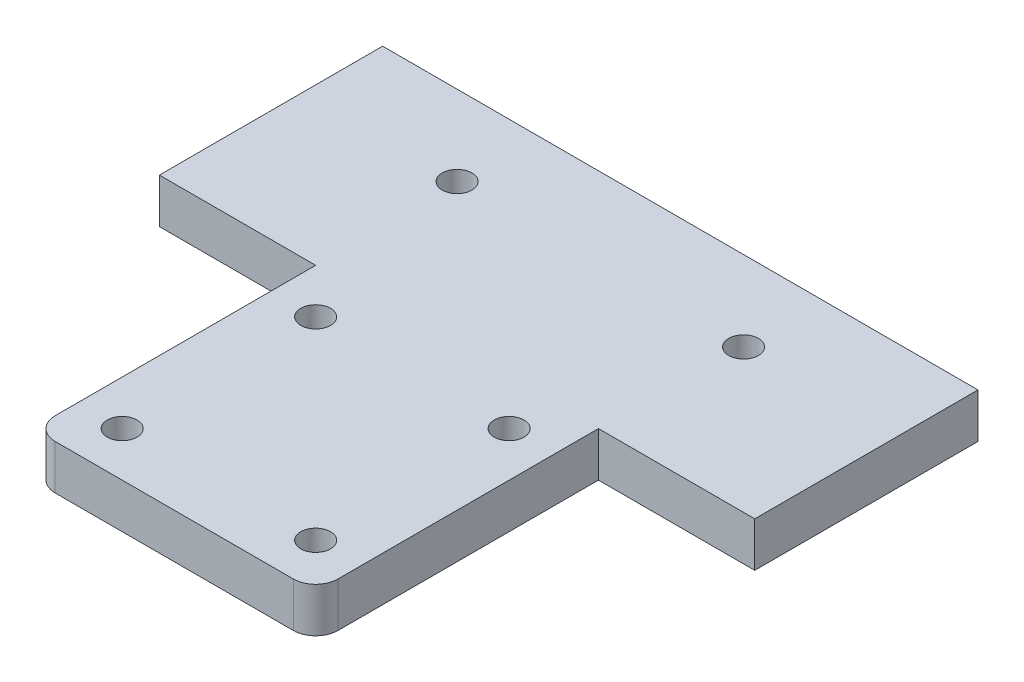
ISO-10303-21;
HEADER;
FILE_DESCRIPTION(('STEP AP214'),'2;1');
FILE_NAME('part.step','',(''),(''),'','','');
FILE_SCHEMA(('AUTOMOTIVE_DESIGN { 1 0 10303 214 1 1 1 1 }'));
ENDSEC;
DATA;
#1=APPLICATION_CONTEXT('core data for automotive mechanical design processes');
#2=APPLICATION_PROTOCOL_DEFINITION('international standard','automotive_design',2000,#1);
#3=PRODUCT_CONTEXT('',#1,'mechanical');
#4=PRODUCT('Part','Part','',(#3));
#5=PRODUCT_RELATED_PRODUCT_CATEGORY('part','',(#4));
#6=PRODUCT_DEFINITION_FORMATION('','',#4);
#7=PRODUCT_DEFINITION_CONTEXT('part definition',#1,'design');
#8=PRODUCT_DEFINITION('design','',#6,#7);
#9=PRODUCT_DEFINITION_SHAPE('','',#8);
#10=(LENGTH_UNIT() NAMED_UNIT(*) SI_UNIT(.MILLI.,.METRE.));
#11=(NAMED_UNIT(*) PLANE_ANGLE_UNIT() SI_UNIT($,.RADIAN.));
#12=(NAMED_UNIT(*) SI_UNIT($,.STERADIAN.) SOLID_ANGLE_UNIT());
#13=UNCERTAINTY_MEASURE_WITH_UNIT(LENGTH_MEASURE(1.E-05),#10,'distance_accuracy_value','');
#14=(GEOMETRIC_REPRESENTATION_CONTEXT(3) GLOBAL_UNCERTAINTY_ASSIGNED_CONTEXT((#13)) GLOBAL_UNIT_ASSIGNED_CONTEXT((#10,
#11,#12)) REPRESENTATION_CONTEXT('',''));
#15=CARTESIAN_POINT('',(0.,0.,0.));
#16=DIRECTION('',(0.,0.,1.));
#17=DIRECTION('',(1.,0.,0.));
#18=AXIS2_PLACEMENT_3D('',#15,#16,#17);
#19=CARTESIAN_POINT('',(32.,0.,-6.));
#20=DIRECTION('',(0.,1.,0.));
#21=DIRECTION('',(0.,0.,1.));
#22=AXIS2_PLACEMENT_3D('',#19,#20,#21);
#23=CYLINDRICAL_SURFACE('',#22,2.);
#24=CARTESIAN_POINT('',(32.,0.,-6.));
#25=DIRECTION('',(0.,1.,0.));
#26=DIRECTION('',(0.,0.,1.));
#27=AXIS2_PLACEMENT_3D('',#24,#25,#26);
#28=CIRCLE('',#27,2.);
#29=CARTESIAN_POINT('',(32.,0.,-4.));
#30=VERTEX_POINT('',#29);
#31=EDGE_CURVE('E195',#30,#30,#28,.T.);
#32=ORIENTED_EDGE('',*,*,#31,.F.);
#33=EDGE_LOOP('',(#32));
#34=FACE_BOUND('',#33,.T.);
#35=CARTESIAN_POINT('',(32.,6.,-6.));
#36=DIRECTION('',(0.,1.,0.));
#37=DIRECTION('',(0.,0.,1.));
#38=AXIS2_PLACEMENT_3D('',#35,#36,#37);
#39=CIRCLE('',#38,2.);
#40=CARTESIAN_POINT('',(32.,6.,-4.));
#41=VERTEX_POINT('',#40);
#42=EDGE_CURVE('E198',#41,#41,#39,.T.);
#43=ORIENTED_EDGE('',*,*,#42,.T.);
#44=EDGE_LOOP('',(#43));
#45=FACE_BOUND('',#44,.T.);
#46=ADVANCED_FACE('F33',(#34,#45),#23,.F.);
#47=CARTESIAN_POINT('',(6.,0.,-6.));
#48=DIRECTION('',(0.,1.,0.));
#49=DIRECTION('',(0.,0.,1.));
#50=AXIS2_PLACEMENT_3D('',#47,#48,#49);
#51=CYLINDRICAL_SURFACE('',#50,2.);
#52=CARTESIAN_POINT('',(6.,0.,-6.));
#53=DIRECTION('',(0.,1.,0.));
#54=DIRECTION('',(0.,0.,1.));
#55=AXIS2_PLACEMENT_3D('',#52,#53,#54);
#56=CIRCLE('',#55,2.);
#57=CARTESIAN_POINT('',(6.,0.,-4.));
#58=VERTEX_POINT('',#57);
#59=EDGE_CURVE('E189',#58,#58,#56,.T.);
#60=ORIENTED_EDGE('',*,*,#59,.F.);
#61=EDGE_LOOP('',(#60));
#62=FACE_BOUND('',#61,.T.);
#63=CARTESIAN_POINT('',(6.,6.,-6.));
#64=DIRECTION('',(0.,1.,0.));
#65=DIRECTION('',(0.,0.,1.));
#66=AXIS2_PLACEMENT_3D('',#63,#64,#65);
#67=CIRCLE('',#66,2.);
#68=CARTESIAN_POINT('',(6.,6.,-4.));
#69=VERTEX_POINT('',#68);
#70=EDGE_CURVE('E192',#69,#69,#67,.T.);
#71=ORIENTED_EDGE('',*,*,#70,.T.);
#72=EDGE_LOOP('',(#71));
#73=FACE_BOUND('',#72,.T.);
#74=ADVANCED_FACE('F252',(#62,#73),#51,.F.);
#75=CARTESIAN_POINT('',(0.,6.,0.));
#76=DIRECTION('',(1.,0.,0.));
#77=DIRECTION('',(0.,0.,-1.));
#78=AXIS2_PLACEMENT_3D('',#75,#76,#77);
#79=PLANE('',#78);
#80=DIRECTION('',(0.,0.,1.));
#81=VECTOR('',#80,1.);
#82=CARTESIAN_POINT('',(0.,0.,0.));
#83=LINE('',#82,#81);
#84=CARTESIAN_POINT('',(0.,0.,-38.));
#85=VERTEX_POINT('',#84);
#86=CARTESIAN_POINT('',(0.,0.,-3.));
#87=VERTEX_POINT('',#86);
#88=EDGE_CURVE('E172',#85,#87,#83,.T.);
#89=ORIENTED_EDGE('',*,*,#88,.T.);
#90=DIRECTION('',(0.,-1.,0.));
#91=VECTOR('',#90,1.);
#92=CARTESIAN_POINT('',(0.,6.,-3.));
#93=LINE('',#92,#91);
#94=CARTESIAN_POINT('',(0.,6.,-3.));
#95=VERTEX_POINT('',#94);
#96=EDGE_CURVE('E11',#87,#95,#93,.F.);
#97=ORIENTED_EDGE('',*,*,#96,.T.);
#98=DIRECTION('',(0.,0.,1.));
#99=VECTOR('',#98,1.);
#100=CARTESIAN_POINT('',(0.,6.,0.));
#101=LINE('',#100,#99);
#102=CARTESIAN_POINT('',(0.,6.,-38.));
#103=VERTEX_POINT('',#102);
#104=EDGE_CURVE('E175',#103,#95,#101,.T.);
#105=ORIENTED_EDGE('',*,*,#104,.F.);
#106=DIRECTION('',(0.,-1.,0.));
#107=VECTOR('',#106,1.);
#108=CARTESIAN_POINT('',(0.,6.,-38.));
#109=LINE('',#108,#107);
#110=EDGE_CURVE('E181',#103,#85,#109,.T.);
#111=ORIENTED_EDGE('',*,*,#110,.T.);
#112=EDGE_LOOP('',(#89,#97,#105,#111));
#113=FACE_BOUND('',#112,.T.);
#114=ADVANCED_FACE('F230',(#113),#79,.F.);
#115=CARTESIAN_POINT('',(0.,6.,0.));
#116=DIRECTION('',(0.,0.,-1.));
#117=DIRECTION('',(-1.,0.,0.));
#118=AXIS2_PLACEMENT_3D('',#115,#116,#117);
#119=PLANE('',#118);
#120=DIRECTION('',(1.,0.,0.));
#121=VECTOR('',#120,1.);
#122=CARTESIAN_POINT('',(0.,0.,0.));
#123=LINE('',#122,#121);
#124=CARTESIAN_POINT('',(3.,0.,0.));
#125=VERTEX_POINT('',#124);
#126=CARTESIAN_POINT('',(35.,0.,0.));
#127=VERTEX_POINT('',#126);
#128=EDGE_CURVE('E183',#125,#127,#123,.T.);
#129=ORIENTED_EDGE('',*,*,#128,.T.);
#130=DIRECTION('',(0.,-1.,0.));
#131=VECTOR('',#130,1.);
#132=CARTESIAN_POINT('',(35.,6.,0.));
#133=LINE('',#132,#131);
#134=CARTESIAN_POINT('',(35.,6.,0.));
#135=VERTEX_POINT('',#134);
#136=EDGE_CURVE('E54',#127,#135,#133,.F.);
#137=ORIENTED_EDGE('',*,*,#136,.T.);
#138=DIRECTION('',(1.,0.,0.));
#139=VECTOR('',#138,1.);
#140=CARTESIAN_POINT('',(0.,6.,0.));
#141=LINE('',#140,#139);
#142=CARTESIAN_POINT('',(3.,6.,0.));
#143=VERTEX_POINT('',#142);
#144=EDGE_CURVE('E177',#143,#135,#141,.T.);
#145=ORIENTED_EDGE('',*,*,#144,.F.);
#146=DIRECTION('',(0.,-1.,0.));
#147=VECTOR('',#146,1.);
#148=CARTESIAN_POINT('',(3.,6.,0.));
#149=LINE('',#148,#147);
#150=EDGE_CURVE('E208',#143,#125,#149,.T.);
#151=ORIENTED_EDGE('',*,*,#150,.T.);
#152=EDGE_LOOP('',(#129,#137,#145,#151));
#153=FACE_BOUND('',#152,.T.);
#154=ADVANCED_FACE('F224',(#153),#119,.F.);
#155=CARTESIAN_POINT('',(38.,6.,0.));
#156=DIRECTION('',(-1.,0.,0.));
#157=DIRECTION('',(0.,0.,1.));
#158=AXIS2_PLACEMENT_3D('',#155,#156,#157);
#159=PLANE('',#158);
#160=DIRECTION('',(0.,0.,-1.));
#161=VECTOR('',#160,1.);
#162=CARTESIAN_POINT('',(38.,6.,0.));
#163=LINE('',#162,#161);
#164=CARTESIAN_POINT('',(38.,6.,-3.));
#165=VERTEX_POINT('',#164);
#166=CARTESIAN_POINT('',(38.,6.,-38.));
#167=VERTEX_POINT('',#166);
#168=EDGE_CURVE('E118',#165,#167,#163,.T.);
#169=ORIENTED_EDGE('',*,*,#168,.F.);
#170=DIRECTION('',(0.,-1.,0.));
#171=VECTOR('',#170,1.);
#172=CARTESIAN_POINT('',(38.,6.,-3.));
#173=LINE('',#172,#171);
#174=CARTESIAN_POINT('',(38.,0.,-3.));
#175=VERTEX_POINT('',#174);
#176=EDGE_CURVE('E201',#165,#175,#173,.T.);
#177=ORIENTED_EDGE('',*,*,#176,.T.);
#178=DIRECTION('',(0.,0.,-1.));
#179=VECTOR('',#178,1.);
#180=CARTESIAN_POINT('',(38.,0.,0.));
#181=LINE('',#180,#179);
#182=CARTESIAN_POINT('',(38.,0.,-38.));
#183=VERTEX_POINT('',#182);
#184=EDGE_CURVE('E178',#175,#183,#181,.T.);
#185=ORIENTED_EDGE('',*,*,#184,.T.);
#186=DIRECTION('',(0.,-1.,0.));
#187=VECTOR('',#186,1.);
#188=CARTESIAN_POINT('',(38.,6.,-38.));
#189=LINE('',#188,#187);
#190=EDGE_CURVE('E187',#167,#183,#189,.T.);
#191=ORIENTED_EDGE('',*,*,#190,.F.);
#192=EDGE_LOOP('',(#169,#177,#185,#191));
#193=FACE_BOUND('',#192,.T.);
#194=ADVANCED_FACE('F217',(#193),#159,.F.);
#195=CARTESIAN_POINT('',(0.,6.,0.));
#196=DIRECTION('',(0.,-1.,0.));
#197=DIRECTION('',(0.,0.,-1.));
#198=AXIS2_PLACEMENT_3D('',#195,#196,#197);
#199=PLANE('',#198);
#200=CARTESIAN_POINT('',(-0.250000000000004,6.,-57.25));
#201=DIRECTION('',(0.,1.,0.));
#202=DIRECTION('',(0.,0.,1.));
#203=AXIS2_PLACEMENT_3D('',#200,#201,#202);
#204=CIRCLE('',#203,2.);
#205=CARTESIAN_POINT('',(-0.250000000000004,6.,-55.25));
#206=VERTEX_POINT('',#205);
#207=EDGE_CURVE('E415',#206,#206,#204,.T.);
#208=ORIENTED_EDGE('',*,*,#207,.F.);
#209=EDGE_LOOP('',(#208));
#210=FACE_BOUND('',#209,.T.);
#211=CARTESIAN_POINT('',(38.25,6.,-57.25));
#212=DIRECTION('',(0.,1.,0.));
#213=DIRECTION('',(0.,0.,1.));
#214=AXIS2_PLACEMENT_3D('',#211,#212,#213);
#215=CIRCLE('',#214,2.);
#216=CARTESIAN_POINT('',(38.25,6.,-55.25));
#217=VERTEX_POINT('',#216);
#218=EDGE_CURVE('E420',#217,#217,#215,.T.);
#219=ORIENTED_EDGE('',*,*,#218,.F.);
#220=EDGE_LOOP('',(#219));
#221=FACE_BOUND('',#220,.T.);
#222=CARTESIAN_POINT('',(32.,6.,-32.));
#223=DIRECTION('',(0.,1.,0.));
#224=DIRECTION('',(0.,0.,1.));
#225=AXIS2_PLACEMENT_3D('',#222,#223,#224);
#226=CIRCLE('',#225,2.);
#227=CARTESIAN_POINT('',(32.,6.,-30.));
#228=VERTEX_POINT('',#227);
#229=EDGE_CURVE('E165',#228,#228,#226,.T.);
#230=ORIENTED_EDGE('',*,*,#229,.F.);
#231=EDGE_LOOP('',(#230));
#232=FACE_BOUND('',#231,.T.);
#233=CARTESIAN_POINT('',(6.,6.,-32.));
#234=DIRECTION('',(0.,1.,0.));
#235=DIRECTION('',(0.,0.,1.));
#236=AXIS2_PLACEMENT_3D('',#233,#234,#235);
#237=CIRCLE('',#236,2.);
#238=CARTESIAN_POINT('',(6.,6.,-30.));
#239=VERTEX_POINT('',#238);
#240=EDGE_CURVE('E168',#239,#239,#237,.T.);
#241=ORIENTED_EDGE('',*,*,#240,.F.);
#242=EDGE_LOOP('',(#241));
#243=FACE_BOUND('',#242,.T.);
#244=ORIENTED_EDGE('',*,*,#144,.T.);
#245=CARTESIAN_POINT('',(35.,6.,-3.));
#246=DIRECTION('',(0.,-1.,0.));
#247=DIRECTION('',(0.,0.,-1.));
#248=AXIS2_PLACEMENT_3D('',#245,#246,#247);
#249=CIRCLE('',#248,3.);
#250=EDGE_CURVE('E41',#135,#165,#249,.F.);
#251=ORIENTED_EDGE('',*,*,#250,.T.);
#252=ORIENTED_EDGE('',*,*,#168,.T.);
#253=DIRECTION('',(1.,0.,0.));
#254=VECTOR('',#253,1.);
#255=CARTESIAN_POINT('',(38.,6.,-38.));
#256=LINE('',#255,#254);
#257=CARTESIAN_POINT('',(59.,6.,-38.));
#258=VERTEX_POINT('',#257);
#259=EDGE_CURVE('E110',#167,#258,#256,.T.);
#260=ORIENTED_EDGE('',*,*,#259,.T.);
#261=DIRECTION('',(0.,0.,-1.));
#262=VECTOR('',#261,1.);
#263=CARTESIAN_POINT('',(59.,6.,-68.));
#264=LINE('',#263,#262);
#265=CARTESIAN_POINT('',(59.,6.,-68.));
#266=VERTEX_POINT('',#265);
#267=EDGE_CURVE('E115',#258,#266,#264,.T.);
#268=ORIENTED_EDGE('',*,*,#267,.T.);
#269=DIRECTION('',(-1.,0.,0.));
#270=VECTOR('',#269,1.);
#271=CARTESIAN_POINT('',(-21.,6.,-68.));
#272=LINE('',#271,#270);
#273=CARTESIAN_POINT('',(-21.,6.,-68.));
#274=VERTEX_POINT('',#273);
#275=EDGE_CURVE('E138',#266,#274,#272,.T.);
#276=ORIENTED_EDGE('',*,*,#275,.T.);
#277=DIRECTION('',(0.,0.,1.));
#278=VECTOR('',#277,1.);
#279=CARTESIAN_POINT('',(-21.,6.,-38.));
#280=LINE('',#279,#278);
#281=CARTESIAN_POINT('',(-21.,6.,-38.));
#282=VERTEX_POINT('',#281);
#283=EDGE_CURVE('E140',#274,#282,#280,.T.);
#284=ORIENTED_EDGE('',*,*,#283,.T.);
#285=EDGE_CURVE('E122',#282,#103,#256,.T.);
#286=ORIENTED_EDGE('',*,*,#285,.T.);
#287=ORIENTED_EDGE('',*,*,#104,.T.);
#288=CARTESIAN_POINT('',(3.,6.,-3.));
#289=DIRECTION('',(0.,-1.,0.));
#290=DIRECTION('',(0.,0.,-1.));
#291=AXIS2_PLACEMENT_3D('',#288,#289,#290);
#292=CIRCLE('',#291,3.);
#293=EDGE_CURVE('E212',#95,#143,#292,.F.);
#294=ORIENTED_EDGE('',*,*,#293,.T.);
#295=EDGE_LOOP('',(#244,#251,#252,#260,#268,#276,#284,#286,#287,#294));
#296=FACE_BOUND('',#295,.T.);
#297=ORIENTED_EDGE('',*,*,#70,.F.);
#298=EDGE_LOOP('',(#297));
#299=FACE_BOUND('',#298,.T.);
#300=ORIENTED_EDGE('',*,*,#42,.F.);
#301=EDGE_LOOP('',(#300));
#302=FACE_BOUND('',#301,.T.);
#303=ADVANCED_FACE('F112',(#210,#221,#232,#243,#296,#299,#302),#199,.F.);
#304=CARTESIAN_POINT('',(0.,0.,0.));
#305=DIRECTION('',(0.,-1.,0.));
#306=DIRECTION('',(0.,0.,-1.));
#307=AXIS2_PLACEMENT_3D('',#304,#305,#306);
#308=PLANE('',#307);
#309=CARTESIAN_POINT('',(-0.250000000000004,0.,-57.25));
#310=DIRECTION('',(0.,1.,0.));
#311=DIRECTION('',(0.,0.,1.));
#312=AXIS2_PLACEMENT_3D('',#309,#310,#311);
#313=CIRCLE('',#312,2.);
#314=CARTESIAN_POINT('',(-0.250000000000004,0.,-55.25));
#315=VERTEX_POINT('',#314);
#316=EDGE_CURVE('E151',#315,#315,#313,.T.);
#317=ORIENTED_EDGE('',*,*,#316,.T.);
#318=EDGE_LOOP('',(#317));
#319=FACE_BOUND('',#318,.T.);
#320=CARTESIAN_POINT('',(38.25,0.,-57.25));
#321=DIRECTION('',(0.,1.,0.));
#322=DIRECTION('',(0.,0.,1.));
#323=AXIS2_PLACEMENT_3D('',#320,#321,#322);
#324=CIRCLE('',#323,2.);
#325=CARTESIAN_POINT('',(38.25,0.,-55.25));
#326=VERTEX_POINT('',#325);
#327=EDGE_CURVE('E416',#326,#326,#324,.T.);
#328=ORIENTED_EDGE('',*,*,#327,.T.);
#329=EDGE_LOOP('',(#328));
#330=FACE_BOUND('',#329,.T.);
#331=CARTESIAN_POINT('',(32.,0.,-32.));
#332=DIRECTION('',(0.,1.,0.));
#333=DIRECTION('',(0.,0.,1.));
#334=AXIS2_PLACEMENT_3D('',#331,#332,#333);
#335=CIRCLE('',#334,2.);
#336=CARTESIAN_POINT('',(32.,0.,-30.));
#337=VERTEX_POINT('',#336);
#338=EDGE_CURVE('E132',#337,#337,#335,.T.);
#339=ORIENTED_EDGE('',*,*,#338,.T.);
#340=EDGE_LOOP('',(#339));
#341=FACE_BOUND('',#340,.T.);
#342=CARTESIAN_POINT('',(6.,0.,-32.));
#343=DIRECTION('',(0.,1.,0.));
#344=DIRECTION('',(0.,0.,1.));
#345=AXIS2_PLACEMENT_3D('',#342,#343,#344);
#346=CIRCLE('',#345,2.);
#347=CARTESIAN_POINT('',(6.,0.,-30.));
#348=VERTEX_POINT('',#347);
#349=EDGE_CURVE('E169',#348,#348,#346,.T.);
#350=ORIENTED_EDGE('',*,*,#349,.T.);
#351=EDGE_LOOP('',(#350));
#352=FACE_BOUND('',#351,.T.);
#353=ORIENTED_EDGE('',*,*,#184,.F.);
#354=CARTESIAN_POINT('',(35.,0.,-3.));
#355=DIRECTION('',(0.,-1.,0.));
#356=DIRECTION('',(0.,0.,-1.));
#357=AXIS2_PLACEMENT_3D('',#354,#355,#356);
#358=CIRCLE('',#357,3.);
#359=EDGE_CURVE('E206',#175,#127,#358,.T.);
#360=ORIENTED_EDGE('',*,*,#359,.T.);
#361=ORIENTED_EDGE('',*,*,#128,.F.);
#362=CARTESIAN_POINT('',(3.,0.,-3.));
#363=DIRECTION('',(0.,-1.,0.));
#364=DIRECTION('',(0.,0.,-1.));
#365=AXIS2_PLACEMENT_3D('',#362,#363,#364);
#366=CIRCLE('',#365,3.);
#367=EDGE_CURVE('E204',#125,#87,#366,.T.);
#368=ORIENTED_EDGE('',*,*,#367,.T.);
#369=ORIENTED_EDGE('',*,*,#88,.F.);
#370=DIRECTION('',(1.,0.,0.));
#371=VECTOR('',#370,1.);
#372=CARTESIAN_POINT('',(0.,0.,-38.));
#373=LINE('',#372,#371);
#374=CARTESIAN_POINT('',(-21.,0.,-38.));
#375=VERTEX_POINT('',#374);
#376=EDGE_CURVE('E123',#375,#85,#373,.T.);
#377=ORIENTED_EDGE('',*,*,#376,.F.);
#378=DIRECTION('',(0.,0.,1.));
#379=VECTOR('',#378,1.);
#380=CARTESIAN_POINT('',(-21.,0.,-38.));
#381=LINE('',#380,#379);
#382=CARTESIAN_POINT('',(-21.,0.,-68.));
#383=VERTEX_POINT('',#382);
#384=EDGE_CURVE('E153',#383,#375,#381,.T.);
#385=ORIENTED_EDGE('',*,*,#384,.F.);
#386=DIRECTION('',(-1.,0.,0.));
#387=VECTOR('',#386,1.);
#388=CARTESIAN_POINT('',(-21.,0.,-68.));
#389=LINE('',#388,#387);
#390=CARTESIAN_POINT('',(59.,0.,-68.));
#391=VERTEX_POINT('',#390);
#392=EDGE_CURVE('E150',#391,#383,#389,.T.);
#393=ORIENTED_EDGE('',*,*,#392,.F.);
#394=DIRECTION('',(0.,0.,-1.));
#395=VECTOR('',#394,1.);
#396=CARTESIAN_POINT('',(59.,0.,-68.));
#397=LINE('',#396,#395);
#398=CARTESIAN_POINT('',(59.,0.,-38.));
#399=VERTEX_POINT('',#398);
#400=EDGE_CURVE('E148',#399,#391,#397,.T.);
#401=ORIENTED_EDGE('',*,*,#400,.F.);
#402=EDGE_CURVE('E129',#183,#399,#373,.T.);
#403=ORIENTED_EDGE('',*,*,#402,.F.);
#404=EDGE_LOOP('',(#353,#360,#361,#368,#369,#377,#385,#393,#401,#403));
#405=FACE_BOUND('',#404,.T.);
#406=ORIENTED_EDGE('',*,*,#59,.T.);
#407=EDGE_LOOP('',(#406));
#408=FACE_BOUND('',#407,.T.);
#409=ORIENTED_EDGE('',*,*,#31,.T.);
#410=EDGE_LOOP('',(#409));
#411=FACE_BOUND('',#410,.T.);
#412=ADVANCED_FACE('F222',(#319,#330,#341,#352,#405,#408,#411),#308,.T.);
#413=CARTESIAN_POINT('',(6.,0.,-32.));
#414=DIRECTION('',(0.,1.,0.));
#415=DIRECTION('',(0.,0.,1.));
#416=AXIS2_PLACEMENT_3D('',#413,#414,#415);
#417=CYLINDRICAL_SURFACE('',#416,2.);
#418=ORIENTED_EDGE('',*,*,#349,.F.);
#419=EDGE_LOOP('',(#418));
#420=FACE_BOUND('',#419,.T.);
#421=ORIENTED_EDGE('',*,*,#240,.T.);
#422=EDGE_LOOP('',(#421));
#423=FACE_BOUND('',#422,.T.);
#424=ADVANCED_FACE('F269',(#420,#423),#417,.F.);
#425=CARTESIAN_POINT('',(32.,0.,-32.));
#426=DIRECTION('',(0.,1.,0.));
#427=DIRECTION('',(0.,0.,1.));
#428=AXIS2_PLACEMENT_3D('',#425,#426,#427);
#429=CYLINDRICAL_SURFACE('',#428,2.);
#430=ORIENTED_EDGE('',*,*,#338,.F.);
#431=EDGE_LOOP('',(#430));
#432=FACE_BOUND('',#431,.T.);
#433=ORIENTED_EDGE('',*,*,#229,.T.);
#434=EDGE_LOOP('',(#433));
#435=FACE_BOUND('',#434,.T.);
#436=ADVANCED_FACE('F264',(#432,#435),#429,.F.);
#437=CARTESIAN_POINT('',(35.,6.,-3.));
#438=DIRECTION('',(0.,-1.,0.));
#439=DIRECTION('',(0.,0.,-1.));
#440=AXIS2_PLACEMENT_3D('',#437,#438,#439);
#441=CYLINDRICAL_SURFACE('',#440,3.);
#442=ORIENTED_EDGE('',*,*,#250,.F.);
#443=ORIENTED_EDGE('',*,*,#136,.F.);
#444=ORIENTED_EDGE('',*,*,#359,.F.);
#445=ORIENTED_EDGE('',*,*,#176,.F.);
#446=EDGE_LOOP('',(#442,#443,#444,#445));
#447=FACE_BOUND('',#446,.T.);
#448=ADVANCED_FACE('F219',(#447),#441,.T.);
#449=CARTESIAN_POINT('',(3.,6.,-3.));
#450=DIRECTION('',(0.,-1.,0.));
#451=DIRECTION('',(0.,0.,-1.));
#452=AXIS2_PLACEMENT_3D('',#449,#450,#451);
#453=CYLINDRICAL_SURFACE('',#452,3.);
#454=ORIENTED_EDGE('',*,*,#293,.F.);
#455=ORIENTED_EDGE('',*,*,#96,.F.);
#456=ORIENTED_EDGE('',*,*,#367,.F.);
#457=ORIENTED_EDGE('',*,*,#150,.F.);
#458=EDGE_LOOP('',(#454,#455,#456,#457));
#459=FACE_BOUND('',#458,.T.);
#460=ADVANCED_FACE('F35',(#459),#453,.T.);
#461=CARTESIAN_POINT('',(0.,6.,-38.));
#462=DIRECTION('',(0.,0.,-1.));
#463=DIRECTION('',(-1.,0.,0.));
#464=AXIS2_PLACEMENT_3D('',#461,#462,#463);
#465=PLANE('',#464);
#466=ORIENTED_EDGE('',*,*,#259,.F.);
#467=ORIENTED_EDGE('',*,*,#190,.T.);
#468=ORIENTED_EDGE('',*,*,#402,.T.);
#469=DIRECTION('',(0.,-1.,0.));
#470=VECTOR('',#469,1.);
#471=CARTESIAN_POINT('',(59.,6.,-38.));
#472=LINE('',#471,#470);
#473=EDGE_CURVE('E126',#258,#399,#472,.T.);
#474=ORIENTED_EDGE('',*,*,#473,.F.);
#475=EDGE_LOOP('',(#466,#467,#468,#474));
#476=FACE_BOUND('',#475,.T.);
#477=ADVANCED_FACE('F127',(#476),#465,.F.);
#478=CARTESIAN_POINT('',(59.,6.,-68.));
#479=DIRECTION('',(-1.,0.,0.));
#480=DIRECTION('',(0.,0.,1.));
#481=AXIS2_PLACEMENT_3D('',#478,#479,#480);
#482=PLANE('',#481);
#483=ORIENTED_EDGE('',*,*,#400,.T.);
#484=DIRECTION('',(0.,-1.,0.));
#485=VECTOR('',#484,1.);
#486=CARTESIAN_POINT('',(59.,6.,-68.));
#487=LINE('',#486,#485);
#488=EDGE_CURVE('E133',#266,#391,#487,.T.);
#489=ORIENTED_EDGE('',*,*,#488,.F.);
#490=ORIENTED_EDGE('',*,*,#267,.F.);
#491=ORIENTED_EDGE('',*,*,#473,.T.);
#492=EDGE_LOOP('',(#483,#489,#490,#491));
#493=FACE_BOUND('',#492,.T.);
#494=ADVANCED_FACE('F135',(#493),#482,.F.);
#495=CARTESIAN_POINT('',(-21.,6.,-68.));
#496=DIRECTION('',(0.,0.,1.));
#497=DIRECTION('',(1.,0.,0.));
#498=AXIS2_PLACEMENT_3D('',#495,#496,#497);
#499=PLANE('',#498);
#500=ORIENTED_EDGE('',*,*,#392,.T.);
#501=DIRECTION('',(0.,-1.,0.));
#502=VECTOR('',#501,1.);
#503=CARTESIAN_POINT('',(-21.,6.,-68.));
#504=LINE('',#503,#502);
#505=EDGE_CURVE('E159',#274,#383,#504,.T.);
#506=ORIENTED_EDGE('',*,*,#505,.F.);
#507=ORIENTED_EDGE('',*,*,#275,.F.);
#508=ORIENTED_EDGE('',*,*,#488,.T.);
#509=EDGE_LOOP('',(#500,#506,#507,#508));
#510=FACE_BOUND('',#509,.T.);
#511=ADVANCED_FACE('F242',(#510),#499,.F.);
#512=CARTESIAN_POINT('',(-21.,6.,-38.));
#513=DIRECTION('',(1.,0.,0.));
#514=DIRECTION('',(0.,0.,-1.));
#515=AXIS2_PLACEMENT_3D('',#512,#513,#514);
#516=PLANE('',#515);
#517=ORIENTED_EDGE('',*,*,#384,.T.);
#518=DIRECTION('',(0.,-1.,0.));
#519=VECTOR('',#518,1.);
#520=CARTESIAN_POINT('',(-21.,6.,-38.));
#521=LINE('',#520,#519);
#522=EDGE_CURVE('E147',#282,#375,#521,.T.);
#523=ORIENTED_EDGE('',*,*,#522,.F.);
#524=ORIENTED_EDGE('',*,*,#283,.F.);
#525=ORIENTED_EDGE('',*,*,#505,.T.);
#526=EDGE_LOOP('',(#517,#523,#524,#525));
#527=FACE_BOUND('',#526,.T.);
#528=ADVANCED_FACE('F238',(#527),#516,.F.);
#529=ORIENTED_EDGE('',*,*,#110,.F.);
#530=ORIENTED_EDGE('',*,*,#285,.F.);
#531=ORIENTED_EDGE('',*,*,#522,.T.);
#532=ORIENTED_EDGE('',*,*,#376,.T.);
#533=EDGE_LOOP('',(#529,#530,#531,#532));
#534=FACE_BOUND('',#533,.T.);
#535=ADVANCED_FACE('F233',(#534),#465,.F.);
#536=CARTESIAN_POINT('',(38.25,0.,-57.25));
#537=DIRECTION('',(0.,1.,0.));
#538=DIRECTION('',(0.,0.,1.));
#539=AXIS2_PLACEMENT_3D('',#536,#537,#538);
#540=CYLINDRICAL_SURFACE('',#539,2.);
#541=ORIENTED_EDGE('',*,*,#327,.F.);
#542=EDGE_LOOP('',(#541));
#543=FACE_BOUND('',#542,.T.);
#544=ORIENTED_EDGE('',*,*,#218,.T.);
#545=EDGE_LOOP('',(#544));
#546=FACE_BOUND('',#545,.T.);
#547=ADVANCED_FACE('F383',(#543,#546),#540,.F.);
#548=CARTESIAN_POINT('',(-0.250000000000004,0.,-57.25));
#549=DIRECTION('',(0.,1.,0.));
#550=DIRECTION('',(0.,0.,1.));
#551=AXIS2_PLACEMENT_3D('',#548,#549,#550);
#552=CYLINDRICAL_SURFACE('',#551,2.);
#553=ORIENTED_EDGE('',*,*,#316,.F.);
#554=EDGE_LOOP('',(#553));
#555=FACE_BOUND('',#554,.T.);
#556=ORIENTED_EDGE('',*,*,#207,.T.);
#557=EDGE_LOOP('',(#556));
#558=FACE_BOUND('',#557,.T.);
#559=ADVANCED_FACE('F395',(#555,#558),#552,.F.);
#560=CLOSED_SHELL('',(#46,#74,#114,#154,#194,#303,#412,#424,#436,#448,#460,#477,#494,#511,#528,
#535,#547,#559));
#561=MANIFOLD_SOLID_BREP('B2',#560);
#562=ADVANCED_BREP_SHAPE_REPRESENTATION('',(#18,#561),#14);
#563=SHAPE_DEFINITION_REPRESENTATION(#9,#562);
ENDSEC;
END-ISO-10303-21;
